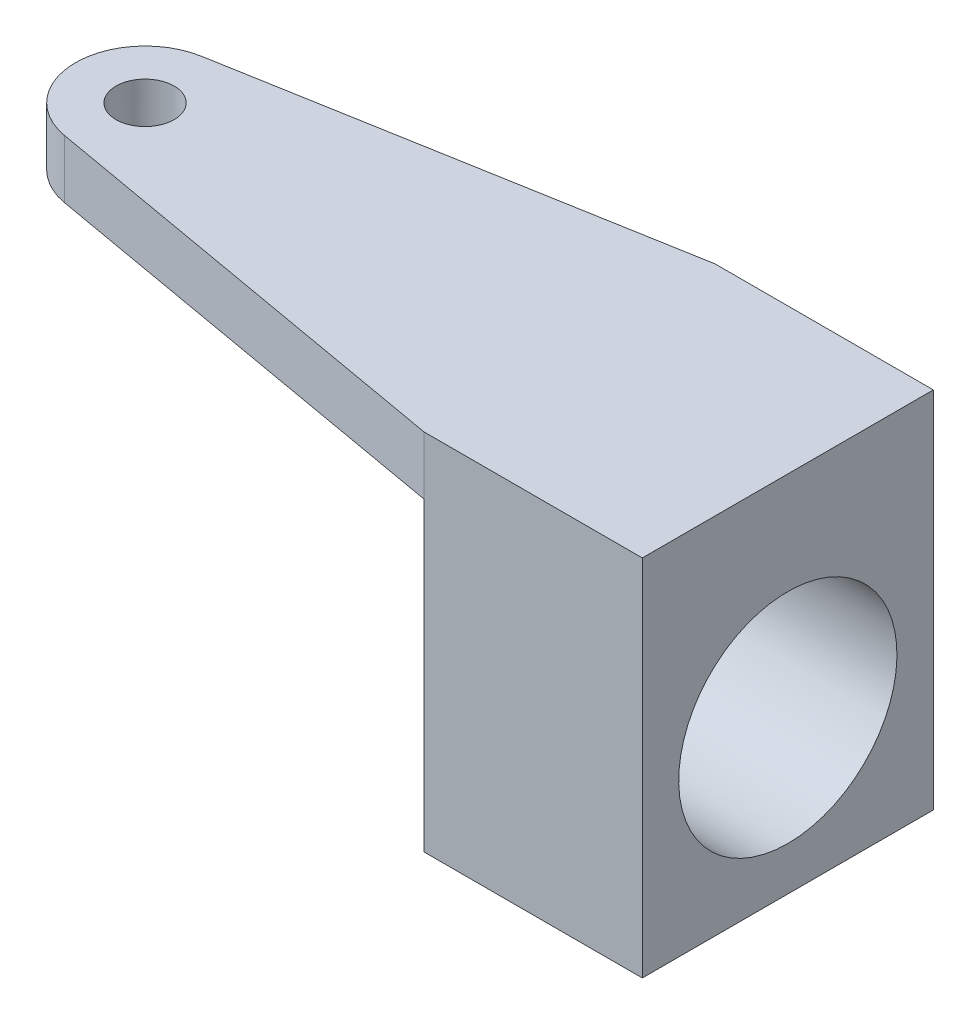
ISO-10303-21;
HEADER;
FILE_DESCRIPTION(('STEP AP214'),'2;1');
FILE_NAME('part.step','',(''),(''),'','','');
FILE_SCHEMA(('AUTOMOTIVE_DESIGN { 1 0 10303 214 1 1 1 1 }'));
ENDSEC;
DATA;
#1=APPLICATION_CONTEXT('core data for automotive mechanical design processes');
#2=APPLICATION_PROTOCOL_DEFINITION('international standard','automotive_design',2000,#1);
#3=PRODUCT_CONTEXT('',#1,'mechanical');
#4=PRODUCT('Part','Part','',(#3));
#5=PRODUCT_RELATED_PRODUCT_CATEGORY('part','',(#4));
#6=PRODUCT_DEFINITION_FORMATION('','',#4);
#7=PRODUCT_DEFINITION_CONTEXT('part definition',#1,'design');
#8=PRODUCT_DEFINITION('design','',#6,#7);
#9=PRODUCT_DEFINITION_SHAPE('','',#8);
#10=(LENGTH_UNIT() NAMED_UNIT(*) SI_UNIT(.MILLI.,.METRE.));
#11=(NAMED_UNIT(*) PLANE_ANGLE_UNIT() SI_UNIT($,.RADIAN.));
#12=(NAMED_UNIT(*) SI_UNIT($,.STERADIAN.) SOLID_ANGLE_UNIT());
#13=UNCERTAINTY_MEASURE_WITH_UNIT(LENGTH_MEASURE(1.E-05),#10,'distance_accuracy_value','');
#14=(GEOMETRIC_REPRESENTATION_CONTEXT(3) GLOBAL_UNCERTAINTY_ASSIGNED_CONTEXT((#13)) GLOBAL_UNIT_ASSIGNED_CONTEXT((#10,
#11,#12)) REPRESENTATION_CONTEXT('',''));
#15=CARTESIAN_POINT('',(0.,0.,0.));
#16=DIRECTION('',(0.,0.,1.));
#17=DIRECTION('',(1.,0.,0.));
#18=AXIS2_PLACEMENT_3D('',#15,#16,#17);
#19=CARTESIAN_POINT('',(0.,-125.,0.));
#20=DIRECTION('',(0.,1.,0.));
#21=DIRECTION('',(0.,0.,1.));
#22=AXIS2_PLACEMENT_3D('',#19,#20,#21);
#23=PLANE('',#22);
#24=DIRECTION('',(-1.,0.,0.));
#25=VECTOR('',#24,1.);
#26=CARTESIAN_POINT('',(145.847331583441,-125.,50.));
#27=LINE('',#26,#25);
#28=CARTESIAN_POINT('',(220.847331583441,-125.,50.));
#29=VERTEX_POINT('',#28);
#30=CARTESIAN_POINT('',(145.847331583441,-125.,50.));
#31=VERTEX_POINT('',#30);
#32=EDGE_CURVE('E168',#29,#31,#27,.T.);
#33=ORIENTED_EDGE('',*,*,#32,.T.);
#34=DIRECTION('',(0.,0.,1.));
#35=VECTOR('',#34,1.);
#36=CARTESIAN_POINT('',(145.847331583441,-125.,-50.));
#37=LINE('',#36,#35);
#38=CARTESIAN_POINT('',(145.847331583441,-125.,-50.));
#39=VERTEX_POINT('',#38);
#40=EDGE_CURVE('E162',#39,#31,#37,.T.);
#41=ORIENTED_EDGE('',*,*,#40,.F.);
#42=DIRECTION('',(1.,0.,0.));
#43=VECTOR('',#42,1.);
#44=CARTESIAN_POINT('',(220.847331583441,-125.,-50.));
#45=LINE('',#44,#43);
#46=CARTESIAN_POINT('',(220.847331583441,-125.,-50.));
#47=VERTEX_POINT('',#46);
#48=EDGE_CURVE('E62',#39,#47,#45,.T.);
#49=ORIENTED_EDGE('',*,*,#48,.T.);
#50=DIRECTION('',(0.,0.,1.));
#51=VECTOR('',#50,1.);
#52=CARTESIAN_POINT('',(220.847331583441,-125.,50.));
#53=LINE('',#52,#51);
#54=EDGE_CURVE('E99',#47,#29,#53,.T.);
#55=ORIENTED_EDGE('',*,*,#54,.T.);
#56=EDGE_LOOP('',(#33,#41,#49,#55));
#57=FACE_BOUND('',#56,.T.);
#58=ADVANCED_FACE('F37',(#57),#23,.F.);
#59=CARTESIAN_POINT('',(0.,0.,0.));
#60=DIRECTION('',(0.,1.,0.));
#61=DIRECTION('',(0.,0.,1.));
#62=AXIS2_PLACEMENT_3D('',#59,#60,#61);
#63=PLANE('',#62);
#64=DIRECTION('',(0.,0.,1.));
#65=VECTOR('',#64,1.);
#66=CARTESIAN_POINT('',(220.847331583441,0.,50.));
#67=LINE('',#66,#65);
#68=CARTESIAN_POINT('',(220.847331583441,0.,-50.));
#69=VERTEX_POINT('',#68);
#70=CARTESIAN_POINT('',(220.847331583441,0.,50.));
#71=VERTEX_POINT('',#70);
#72=EDGE_CURVE('E105',#69,#71,#67,.T.);
#73=ORIENTED_EDGE('',*,*,#72,.F.);
#74=DIRECTION('',(1.,0.,0.));
#75=VECTOR('',#74,1.);
#76=CARTESIAN_POINT('',(220.847331583441,0.,-50.));
#77=LINE('',#76,#75);
#78=CARTESIAN_POINT('',(145.847331583441,0.,-50.));
#79=VERTEX_POINT('',#78);
#80=EDGE_CURVE('E87',#79,#69,#77,.T.);
#81=ORIENTED_EDGE('',*,*,#80,.F.);
#82=DIRECTION('',(0.984807753012208,0.,-0.173648177666931));
#83=VECTOR('',#82,1.);
#84=CARTESIAN_POINT('',(145.847331583441,0.,-50.));
#85=LINE('',#84,#83);
#86=CARTESIAN_POINT('',(-4.15266841655876,0.,-23.5509528937301));
#87=VERTEX_POINT('',#86);
#88=EDGE_CURVE('E100',#87,#79,#85,.T.);
#89=ORIENTED_EDGE('',*,*,#88,.F.);
#90=CARTESIAN_POINT('',(0.,0.,0.));
#91=DIRECTION('',(0.,-1.,0.));
#92=DIRECTION('',(0.,0.,1.));
#93=AXIS2_PLACEMENT_3D('',#90,#91,#92);
#94=CIRCLE('',#93,23.9142643035612);
#95=CARTESIAN_POINT('',(-4.15266841655876,0.,23.5509528937301));
#96=VERTEX_POINT('',#95);
#97=EDGE_CURVE('E123',#96,#87,#94,.T.);
#98=ORIENTED_EDGE('',*,*,#97,.F.);
#99=DIRECTION('',(-0.984807753012208,0.,-0.173648177666931));
#100=VECTOR('',#99,1.);
#101=CARTESIAN_POINT('',(-4.15266841655877,0.,23.5509528937301));
#102=LINE('',#101,#100);
#103=CARTESIAN_POINT('',(145.847331583441,0.,50.));
#104=VERTEX_POINT('',#103);
#105=EDGE_CURVE('E114',#104,#96,#102,.T.);
#106=ORIENTED_EDGE('',*,*,#105,.F.);
#107=DIRECTION('',(-1.,0.,0.));
#108=VECTOR('',#107,1.);
#109=CARTESIAN_POINT('',(145.847331583441,0.,50.));
#110=LINE('',#109,#108);
#111=EDGE_CURVE('E111',#71,#104,#110,.T.);
#112=ORIENTED_EDGE('',*,*,#111,.F.);
#113=EDGE_LOOP('',(#73,#81,#89,#98,#106,#112));
#114=FACE_BOUND('',#113,.T.);
#115=CARTESIAN_POINT('',(0.,0.,0.));
#116=DIRECTION('',(0.,-1.,0.));
#117=DIRECTION('',(0.,0.,-1.));
#118=AXIS2_PLACEMENT_3D('',#115,#116,#117);
#119=CIRCLE('',#118,10.);
#120=CARTESIAN_POINT('',(0.,0.,-10.));
#121=VERTEX_POINT('',#120);
#122=EDGE_CURVE('E112',#121,#121,#119,.T.);
#123=ORIENTED_EDGE('',*,*,#122,.T.);
#124=EDGE_LOOP('',(#123));
#125=FACE_BOUND('',#124,.T.);
#126=ADVANCED_FACE('F107',(#114,#125),#63,.T.);
#127=CARTESIAN_POINT('',(220.847331583441,-125.,50.));
#128=DIRECTION('',(-1.,0.,0.));
#129=DIRECTION('',(0.,0.,1.));
#130=AXIS2_PLACEMENT_3D('',#127,#128,#129);
#131=PLANE('',#130);
#132=CARTESIAN_POINT('',(220.847331583441,-72.5,0.));
#133=DIRECTION('',(-1.,0.,0.));
#134=DIRECTION('',(0.,-1.,0.));
#135=AXIS2_PLACEMENT_3D('',#132,#133,#134);
#136=CIRCLE('',#135,37.5);
#137=CARTESIAN_POINT('',(220.847331583441,-110.,0.));
#138=VERTEX_POINT('',#137);
#139=EDGE_CURVE('E166',#138,#138,#136,.T.);
#140=ORIENTED_EDGE('',*,*,#139,.T.);
#141=EDGE_LOOP('',(#140));
#142=FACE_BOUND('',#141,.T.);
#143=ORIENTED_EDGE('',*,*,#72,.T.);
#144=DIRECTION('',(0.,1.,0.));
#145=VECTOR('',#144,1.);
#146=CARTESIAN_POINT('',(220.847331583441,-125.,50.));
#147=LINE('',#146,#145);
#148=EDGE_CURVE('E12',#29,#71,#147,.T.);
#149=ORIENTED_EDGE('',*,*,#148,.F.);
#150=ORIENTED_EDGE('',*,*,#54,.F.);
#151=DIRECTION('',(0.,1.,0.));
#152=VECTOR('',#151,1.);
#153=CARTESIAN_POINT('',(220.847331583441,-125.,-50.));
#154=LINE('',#153,#152);
#155=EDGE_CURVE('E90',#47,#69,#154,.T.);
#156=ORIENTED_EDGE('',*,*,#155,.T.);
#157=EDGE_LOOP('',(#143,#149,#150,#156));
#158=FACE_BOUND('',#157,.T.);
#159=ADVANCED_FACE('F39',(#142,#158),#131,.F.);
#160=CARTESIAN_POINT('',(145.847331583441,-125.,50.));
#161=DIRECTION('',(0.,0.,-1.));
#162=DIRECTION('',(-1.,0.,0.));
#163=AXIS2_PLACEMENT_3D('',#160,#161,#162);
#164=PLANE('',#163);
#165=ORIENTED_EDGE('',*,*,#111,.T.);
#166=DIRECTION('',(0.,1.,0.));
#167=VECTOR('',#166,1.);
#168=CARTESIAN_POINT('',(145.847331583441,-125.,50.));
#169=LINE('',#168,#167);
#170=CARTESIAN_POINT('',(145.847331583441,-20.,50.));
#171=VERTEX_POINT('',#170);
#172=EDGE_CURVE('E133',#171,#104,#169,.T.);
#173=ORIENTED_EDGE('',*,*,#172,.F.);
#174=EDGE_CURVE('E46',#31,#171,#169,.T.);
#175=ORIENTED_EDGE('',*,*,#174,.F.);
#176=ORIENTED_EDGE('',*,*,#32,.F.);
#177=ORIENTED_EDGE('',*,*,#148,.T.);
#178=EDGE_LOOP('',(#165,#173,#175,#176,#177));
#179=FACE_BOUND('',#178,.T.);
#180=ADVANCED_FACE('F148',(#179),#164,.F.);
#181=CARTESIAN_POINT('',(-4.15266841655877,-125.,23.5509528937301));
#182=DIRECTION('',(0.173648177666931,0.,-0.984807753012208));
#183=DIRECTION('',(-0.984807753012208,0.,-0.173648177666931));
#184=AXIS2_PLACEMENT_3D('',#181,#182,#183);
#185=PLANE('',#184);
#186=DIRECTION('',(0.,1.,0.));
#187=VECTOR('',#186,1.);
#188=CARTESIAN_POINT('',(-4.15266841655876,-125.,23.5509528937301));
#189=LINE('',#188,#187);
#190=CARTESIAN_POINT('',(-4.15266841655879,-20.,23.5509528937301));
#191=VERTEX_POINT('',#190);
#192=EDGE_CURVE('E131',#191,#96,#189,.T.);
#193=ORIENTED_EDGE('',*,*,#192,.F.);
#194=DIRECTION('',(-0.984807753012208,0.,-0.173648177666931));
#195=VECTOR('',#194,1.);
#196=CARTESIAN_POINT('',(145.847331583441,-20.,50.));
#197=LINE('',#196,#195);
#198=EDGE_CURVE('E146',#171,#191,#197,.T.);
#199=ORIENTED_EDGE('',*,*,#198,.F.);
#200=ORIENTED_EDGE('',*,*,#172,.T.);
#201=ORIENTED_EDGE('',*,*,#105,.T.);
#202=EDGE_LOOP('',(#193,#199,#200,#201));
#203=FACE_BOUND('',#202,.T.);
#204=ADVANCED_FACE('F143',(#203),#185,.F.);
#205=CARTESIAN_POINT('',(0.,-125.,0.));
#206=DIRECTION('',(0.,1.,0.));
#207=DIRECTION('',(0.,0.,1.));
#208=AXIS2_PLACEMENT_3D('',#205,#206,#207);
#209=CYLINDRICAL_SURFACE('',#208,23.9142643035612);
#210=DIRECTION('',(0.,1.,0.));
#211=VECTOR('',#210,1.);
#212=CARTESIAN_POINT('',(-4.15266841655876,-125.,-23.5509528937301));
#213=LINE('',#212,#211);
#214=CARTESIAN_POINT('',(-4.15266841655878,-20.,-23.5509528937301));
#215=VERTEX_POINT('',#214);
#216=EDGE_CURVE('E129',#215,#87,#213,.T.);
#217=ORIENTED_EDGE('',*,*,#216,.F.);
#218=CARTESIAN_POINT('',(0.,-20.,0.));
#219=DIRECTION('',(0.,1.,0.));
#220=DIRECTION('',(0.,0.,1.));
#221=AXIS2_PLACEMENT_3D('',#218,#219,#220);
#222=CIRCLE('',#221,23.9142643035612);
#223=EDGE_CURVE('E155',#191,#215,#222,.F.);
#224=ORIENTED_EDGE('',*,*,#223,.F.);
#225=ORIENTED_EDGE('',*,*,#192,.T.);
#226=ORIENTED_EDGE('',*,*,#97,.T.);
#227=EDGE_LOOP('',(#217,#224,#225,#226));
#228=FACE_BOUND('',#227,.T.);
#229=ADVANCED_FACE('F151',(#228),#209,.T.);
#230=CARTESIAN_POINT('',(145.847331583441,-125.,-50.));
#231=DIRECTION('',(0.173648177666931,0.,0.984807753012208));
#232=DIRECTION('',(0.984807753012208,0.,-0.173648177666931));
#233=AXIS2_PLACEMENT_3D('',#230,#231,#232);
#234=PLANE('',#233);
#235=DIRECTION('',(0.,1.,0.));
#236=VECTOR('',#235,1.);
#237=CARTESIAN_POINT('',(145.847331583441,-125.,-50.));
#238=LINE('',#237,#236);
#239=CARTESIAN_POINT('',(145.847331583441,-20.,-50.));
#240=VERTEX_POINT('',#239);
#241=EDGE_CURVE('E94',#240,#79,#238,.T.);
#242=ORIENTED_EDGE('',*,*,#241,.F.);
#243=DIRECTION('',(0.984807753012208,0.,-0.173648177666931));
#244=VECTOR('',#243,1.);
#245=CARTESIAN_POINT('',(-4.15266841655879,-20.,-23.5509528937301));
#246=LINE('',#245,#244);
#247=EDGE_CURVE('E53',#215,#240,#246,.T.);
#248=ORIENTED_EDGE('',*,*,#247,.F.);
#249=ORIENTED_EDGE('',*,*,#216,.T.);
#250=ORIENTED_EDGE('',*,*,#88,.T.);
#251=EDGE_LOOP('',(#242,#248,#249,#250));
#252=FACE_BOUND('',#251,.T.);
#253=ADVANCED_FACE('F207',(#252),#234,.F.);
#254=CARTESIAN_POINT('',(220.847331583441,-125.,-50.));
#255=DIRECTION('',(0.,0.,1.));
#256=DIRECTION('',(1.,0.,0.));
#257=AXIS2_PLACEMENT_3D('',#254,#255,#256);
#258=PLANE('',#257);
#259=ORIENTED_EDGE('',*,*,#80,.T.);
#260=ORIENTED_EDGE('',*,*,#155,.F.);
#261=ORIENTED_EDGE('',*,*,#48,.F.);
#262=EDGE_CURVE('E127',#39,#240,#238,.T.);
#263=ORIENTED_EDGE('',*,*,#262,.T.);
#264=ORIENTED_EDGE('',*,*,#241,.T.);
#265=EDGE_LOOP('',(#259,#260,#261,#263,#264));
#266=FACE_BOUND('',#265,.T.);
#267=ADVANCED_FACE('F89',(#266),#258,.F.);
#268=CARTESIAN_POINT('',(0.,-125.,0.));
#269=DIRECTION('',(0.,1.,0.));
#270=DIRECTION('',(0.,0.,1.));
#271=AXIS2_PLACEMENT_3D('',#268,#269,#270);
#272=CYLINDRICAL_SURFACE('',#271,10.);
#273=CARTESIAN_POINT('',(0.,-20.,0.));
#274=DIRECTION('',(0.,1.,0.));
#275=DIRECTION('',(0.,0.,1.));
#276=AXIS2_PLACEMENT_3D('',#273,#274,#275);
#277=CIRCLE('',#276,10.);
#278=CARTESIAN_POINT('',(0.,-20.,10.));
#279=VERTEX_POINT('',#278);
#280=EDGE_CURVE('E41',#279,#279,#277,.T.);
#281=ORIENTED_EDGE('',*,*,#280,.F.);
#282=EDGE_LOOP('',(#281));
#283=FACE_BOUND('',#282,.T.);
#284=ORIENTED_EDGE('',*,*,#122,.F.);
#285=EDGE_LOOP('',(#284));
#286=FACE_BOUND('',#285,.T.);
#287=ADVANCED_FACE('F194',(#283,#286),#272,.F.);
#288=CARTESIAN_POINT('',(0.,-20.,0.));
#289=DIRECTION('',(0.,1.,0.));
#290=DIRECTION('',(0.,0.,1.));
#291=AXIS2_PLACEMENT_3D('',#288,#289,#290);
#292=PLANE('',#291);
#293=ORIENTED_EDGE('',*,*,#280,.T.);
#294=EDGE_LOOP('',(#293));
#295=FACE_BOUND('',#294,.T.);
#296=ORIENTED_EDGE('',*,*,#247,.T.);
#297=DIRECTION('',(0.,0.,1.));
#298=VECTOR('',#297,1.);
#299=CARTESIAN_POINT('',(145.847331583441,-20.,-50.));
#300=LINE('',#299,#298);
#301=EDGE_CURVE('E165',#240,#171,#300,.T.);
#302=ORIENTED_EDGE('',*,*,#301,.T.);
#303=ORIENTED_EDGE('',*,*,#198,.T.);
#304=ORIENTED_EDGE('',*,*,#223,.T.);
#305=EDGE_LOOP('',(#296,#302,#303,#304));
#306=FACE_BOUND('',#305,.T.);
#307=ADVANCED_FACE('F189',(#295,#306),#292,.F.);
#308=CARTESIAN_POINT('',(145.847331583441,197.025377649941,-50.));
#309=DIRECTION('',(1.,0.,0.));
#310=DIRECTION('',(0.,1.,0.));
#311=AXIS2_PLACEMENT_3D('',#308,#309,#310);
#312=PLANE('',#311);
#313=CARTESIAN_POINT('',(145.847331583441,-72.5,0.));
#314=DIRECTION('',(-1.,0.,0.));
#315=DIRECTION('',(0.,-1.,0.));
#316=AXIS2_PLACEMENT_3D('',#313,#314,#315);
#317=CIRCLE('',#316,37.5);
#318=CARTESIAN_POINT('',(145.847331583441,-110.,0.));
#319=VERTEX_POINT('',#318);
#320=EDGE_CURVE('E175',#319,#319,#317,.T.);
#321=ORIENTED_EDGE('',*,*,#320,.F.);
#322=EDGE_LOOP('',(#321));
#323=FACE_BOUND('',#322,.T.);
#324=ORIENTED_EDGE('',*,*,#262,.F.);
#325=ORIENTED_EDGE('',*,*,#40,.T.);
#326=ORIENTED_EDGE('',*,*,#174,.T.);
#327=ORIENTED_EDGE('',*,*,#301,.F.);
#328=EDGE_LOOP('',(#324,#325,#326,#327));
#329=FACE_BOUND('',#328,.T.);
#330=ADVANCED_FACE('F164',(#323,#329),#312,.F.);
#331=CARTESIAN_POINT('',(220.847331583441,-72.5,0.));
#332=DIRECTION('',(-1.,0.,0.));
#333=DIRECTION('',(0.,-1.,0.));
#334=AXIS2_PLACEMENT_3D('',#331,#332,#333);
#335=CYLINDRICAL_SURFACE('',#334,37.5);
#336=ORIENTED_EDGE('',*,*,#139,.F.);
#337=EDGE_LOOP('',(#336));
#338=FACE_BOUND('',#337,.T.);
#339=ORIENTED_EDGE('',*,*,#320,.T.);
#340=EDGE_LOOP('',(#339));
#341=FACE_BOUND('',#340,.T.);
#342=ADVANCED_FACE('F182',(#338,#341),#335,.F.);
#343=CLOSED_SHELL('',(#58,#126,#159,#180,#204,#229,#253,#267,#287,#307,#330,#342));
#344=MANIFOLD_SOLID_BREP('B2',#343);
#345=ADVANCED_BREP_SHAPE_REPRESENTATION('',(#18,#344),#14);
#346=SHAPE_DEFINITION_REPRESENTATION(#9,#345);
ENDSEC;
END-ISO-10303-21;
